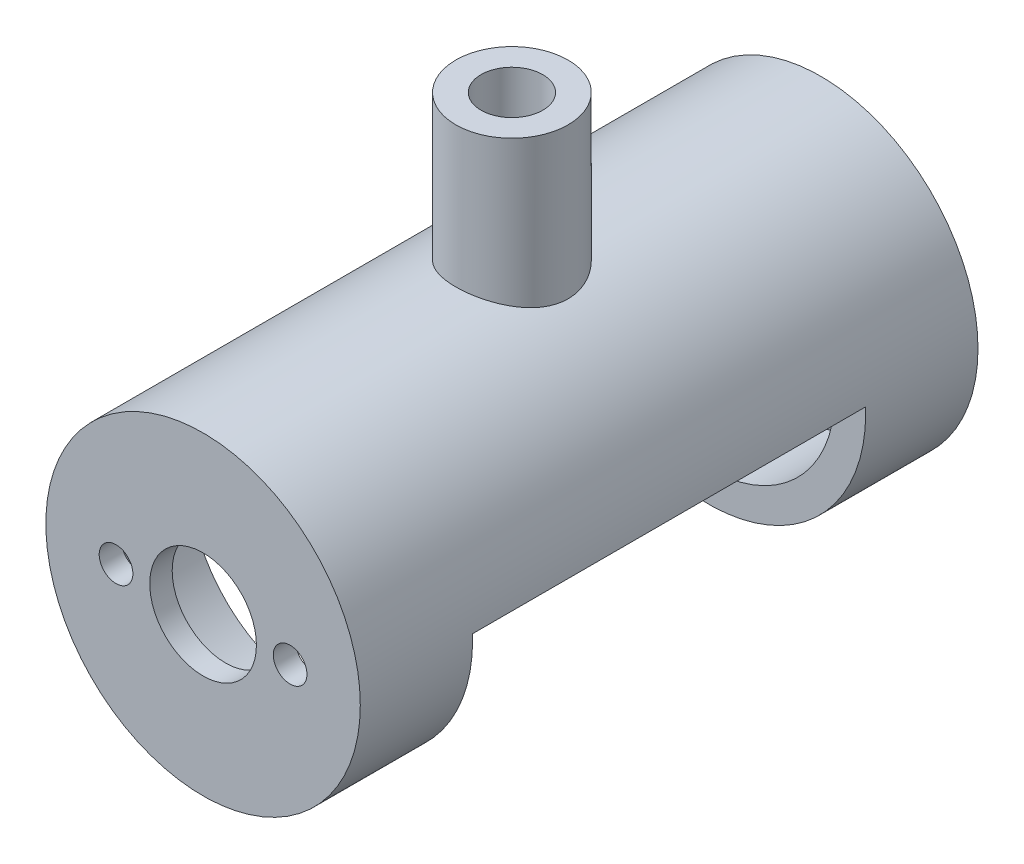
ISO-10303-21;
HEADER;
FILE_DESCRIPTION(('STEP AP214'),'2;1');
FILE_NAME('part.step','',(''),(''),'','','');
FILE_SCHEMA(('AUTOMOTIVE_DESIGN { 1 0 10303 214 1 1 1 1 }'));
ENDSEC;
DATA;
#1=APPLICATION_CONTEXT('core data for automotive mechanical design processes');
#2=APPLICATION_PROTOCOL_DEFINITION('international standard','automotive_design',2000,#1);
#3=PRODUCT_CONTEXT('',#1,'mechanical');
#4=PRODUCT('Part','Part','',(#3));
#5=PRODUCT_RELATED_PRODUCT_CATEGORY('part','',(#4));
#6=PRODUCT_DEFINITION_FORMATION('','',#4);
#7=PRODUCT_DEFINITION_CONTEXT('part definition',#1,'design');
#8=PRODUCT_DEFINITION('design','',#6,#7);
#9=PRODUCT_DEFINITION_SHAPE('','',#8);
#10=(LENGTH_UNIT() NAMED_UNIT(*) SI_UNIT(.MILLI.,.METRE.));
#11=(NAMED_UNIT(*) PLANE_ANGLE_UNIT() SI_UNIT($,.RADIAN.));
#12=(NAMED_UNIT(*) SI_UNIT($,.STERADIAN.) SOLID_ANGLE_UNIT());
#13=UNCERTAINTY_MEASURE_WITH_UNIT(LENGTH_MEASURE(1.E-05),#10,'distance_accuracy_value','');
#14=(GEOMETRIC_REPRESENTATION_CONTEXT(3) GLOBAL_UNCERTAINTY_ASSIGNED_CONTEXT((#13)) GLOBAL_UNIT_ASSIGNED_CONTEXT((#10,
#11,#12)) REPRESENTATION_CONTEXT('',''));
#15=CARTESIAN_POINT('',(0.,0.,0.));
#16=DIRECTION('',(0.,0.,1.));
#17=DIRECTION('',(1.,0.,0.));
#18=AXIS2_PLACEMENT_3D('',#15,#16,#17);
#19=CARTESIAN_POINT('',(0.,-13.5,17.5));
#20=DIRECTION('',(0.,0.,1.));
#21=DIRECTION('',(1.,0.,0.));
#22=AXIS2_PLACEMENT_3D('',#19,#20,#21);
#23=CYLINDRICAL_SURFACE('',#22,14.);
#24=CARTESIAN_POINT('',(0.,-13.5,27.5));
#25=DIRECTION('',(0.,0.,1.));
#26=DIRECTION('',(1.,0.,0.));
#27=AXIS2_PLACEMENT_3D('',#24,#25,#26);
#28=CIRCLE('',#27,14.);
#29=CARTESIAN_POINT('',(14.,-13.5,27.5));
#30=VERTEX_POINT('',#29);
#31=EDGE_CURVE('E95',#30,#30,#28,.T.);
#32=ORIENTED_EDGE('',*,*,#31,.F.);
#33=EDGE_LOOP('',(#32));
#34=FACE_BOUND('',#33,.T.);
#35=CARTESIAN_POINT('',(0.,-13.5,-27.5));
#36=DIRECTION('',(0.,0.,-1.));
#37=DIRECTION('',(-1.,0.,0.));
#38=AXIS2_PLACEMENT_3D('',#35,#36,#37);
#39=CIRCLE('',#38,14.);
#40=CARTESIAN_POINT('',(-14.,-13.5,-27.5));
#41=VERTEX_POINT('',#40);
#42=EDGE_CURVE('E336',#41,#41,#39,.T.);
#43=ORIENTED_EDGE('',*,*,#42,.F.);
#44=EDGE_LOOP('',(#43));
#45=FACE_BOUND('',#44,.T.);
#46=CARTESIAN_POINT('',(0.,0.500000000000002,-5.));
#47=CARTESIAN_POINT('',(-0.135809737919825,0.500000251942587,-5.00000035109385));
#48=CARTESIAN_POINT('',(-0.271614291106981,0.498019447118669,-4.99446237936254));
#49=CARTESIAN_POINT('',(-0.54225702023089,0.490149722900442,-4.9723632682536));
#50=CARTESIAN_POINT('',(-0.677094853246566,0.484259479944528,-4.95579839565292));
#51=CARTESIAN_POINT('',(-0.944706220002117,0.468732511716306,-4.91181333578734));
#52=CARTESIAN_POINT('',(-1.07748062003744,0.459097405411395,-4.88439783933596));
#53=CARTESIAN_POINT('',(-1.34013264362942,0.436334946742313,-4.81895962664486));
#54=CARTESIAN_POINT('',(-1.47000912344286,0.423206241063059,-4.78093279961728));
#55=CARTESIAN_POINT('',(-1.72565362119309,0.393834215093142,-4.69470647940391));
#56=CARTESIAN_POINT('',(-1.85143019462852,0.377597941204405,-4.64652997614828));
#57=CARTESIAN_POINT('',(-2.09839082390053,0.342411329146884,-4.54035817719618));
#58=CARTESIAN_POINT('',(-2.21957315806502,0.323459985985932,-4.48235924423965));
#59=CARTESIAN_POINT('',(-2.5750514260562,0.26323615584615,-4.29427960203682));
#60=CARTESIAN_POINT('',(-2.80148404260274,0.218569115647151,-4.15004629674891));
#61=CARTESIAN_POINT('',(-3.23521018737559,0.122944996946077,-3.82230730123168));
#62=CARTESIAN_POINT('',(-3.44154890844616,0.0718218038497477,-3.63759747563023));
#63=CARTESIAN_POINT('',(-3.82117539449033,-0.0301348056194891,-3.23647232549485));
#64=CARTESIAN_POINT('',(-3.99445436166886,-0.0809681413744132,-3.02004858833491));
#65=CARTESIAN_POINT('',(-4.22869107129882,-0.153645194820497,-2.67183755280845));
#66=CARTESIAN_POINT('',(-4.30350471308028,-0.177642572916036,-2.54959495053473));
#67=CARTESIAN_POINT('',(-4.44251308945513,-0.223350441766006,-2.29882464995287));
#68=CARTESIAN_POINT('',(-4.50671205240721,-0.245061841882197,-2.17029948086912));
#69=CARTESIAN_POINT('',(-4.62396036382352,-0.285506329317238,-1.90779090944507));
#70=CARTESIAN_POINT('',(-4.67700810768227,-0.304238987915534,-1.7738067248863));
#71=CARTESIAN_POINT('',(-4.77143074296404,-0.338086545457018,-1.50140369514912));
#72=CARTESIAN_POINT('',(-4.81281112444964,-0.353203145422675,-1.36298696995622));
#73=CARTESIAN_POINT('',(-4.88217802905966,-0.378808975326995,-1.08797498593406));
#74=CARTESIAN_POINT('',(-4.91060827509873,-0.389450353189266,-0.951505775033819));
#75=CARTESIAN_POINT('',(-4.95598710062016,-0.406536677500179,-0.676467104740633));
#76=CARTESIAN_POINT('',(-4.97294059537927,-0.412983420386088,-0.537898570478235));
#77=CARTESIAN_POINT('',(-4.99519971662274,-0.421463294424703,-0.259709554116053));
#78=CARTESIAN_POINT('',(-5.00050665418348,-0.423496922370344,-0.120089192198412));
#79=CARTESIAN_POINT('',(-4.999417266875,-0.423080326941804,0.159096539436708));
#80=CARTESIAN_POINT('',(-4.99302133885951,-0.42063025561352,0.298661910858433));
#81=CARTESIAN_POINT('',(-4.96925582787826,-0.41158354442139,0.569145442822823));
#82=CARTESIAN_POINT('',(-4.95249439155337,-0.40521679841965,0.700125268075855));
#83=CARTESIAN_POINT('',(-4.90871467197179,-0.388742756508352,0.960162601185794));
#84=CARTESIAN_POINT('',(-4.88169296148016,-0.37863421075543,1.08921945172624));
#85=CARTESIAN_POINT('',(-4.81764465994201,-0.354983287916082,1.34447110183311));
#86=CARTESIAN_POINT('',(-4.78062076223466,-0.341441835286116,1.47066666197233));
#87=CARTESIAN_POINT('',(-4.69688836619738,-0.311322622511204,1.71944630486636));
#88=CARTESIAN_POINT('',(-4.65017616340986,-0.294743701231724,1.84202898565018));
#89=CARTESIAN_POINT('',(-4.49423824121893,-0.240507841022739,2.20740062064977));
#90=CARTESIAN_POINT('',(-4.37029651313278,-0.19877406549533,2.44349976838012));
#91=CARTESIAN_POINT('',(-4.08729285529162,-0.109107584103893,2.89215222293252));
#92=CARTESIAN_POINT('',(-3.92821963194589,-0.061172886910109,3.10469792504487));
#93=CARTESIAN_POINT('',(-3.56806665841638,0.0390490871924341,3.51390766730794));
#94=CARTESIAN_POINT('',(-3.36502761599936,0.0914242329657868,3.70883263121443));
#95=CARTESIAN_POINT('',(-2.92852270488315,0.192109708661412,4.06234645334349));
#96=CARTESIAN_POINT('',(-2.6950529952813,0.240419524196391,4.22093071772918));
#97=CARTESIAN_POINT('',(-2.20020095435867,0.328339909702287,4.4989603760333));
#98=CARTESIAN_POINT('',(-1.93849829448506,0.3678306254663,4.6178762502915));
#99=CARTESIAN_POINT('',(-1.39704686664782,0.432783371681879,4.80943187771662));
#100=CARTESIAN_POINT('',(-1.11730538803626,0.458251029551668,4.8820901957571));
#101=CARTESIAN_POINT('',(-0.562410193206385,0.491324045947987,4.97583823071772));
#102=CARTESIAN_POINT('',(-0.287701200751391,0.499742070081218,4.99927619349799));
#103=CARTESIAN_POINT('',(0.261818717565054,0.500245967713009,5.00069031196031));
#104=CARTESIAN_POINT('',(0.536629612533589,0.492335070027901,4.97867545530265));
#105=CARTESIAN_POINT('',(1.06873750606474,0.461606968129953,4.89162753091541));
#106=CARTESIAN_POINT('',(1.32631209719196,0.439308240693985,4.82808978733781));
#107=CARTESIAN_POINT('',(1.82699848697875,0.382565031642997,4.66172751168481));
#108=CARTESIAN_POINT('',(2.07010840306846,0.348118973082872,4.55889787866075));
#109=CARTESIAN_POINT('',(2.54263735557131,0.269314348221594,4.31367960924547));
#110=CARTESIAN_POINT('',(2.77147674291151,0.224703573589509,4.17025689304724));
#111=CARTESIAN_POINT('',(3.20255291901186,0.130569586508632,3.84915515922489));
#112=CARTESIAN_POINT('',(3.40478054113731,0.0810446916018416,3.67146438938956));
#113=CARTESIAN_POINT('',(3.78806872243883,-0.0206857720331122,3.27570082530642));
#114=CARTESIAN_POINT('',(3.96746111928894,-0.0728956027525246,3.05599799034036));
#115=CARTESIAN_POINT('',(4.20707029265235,-0.146813927178992,2.7056737540284));
#116=CARTESIAN_POINT('',(4.282062011313,-0.17073333704006,2.58536086339757));
#117=CARTESIAN_POINT('',(4.4217048104309,-0.216404300549642,2.33850379149571));
#118=CARTESIAN_POINT('',(4.48636023864871,-0.238156764223399,2.21196225963213));
#119=CARTESIAN_POINT('',(4.60489690992007,-0.27884787105452,1.95325604595851));
#120=CARTESIAN_POINT('',(4.65876125884398,-0.297782090341165,1.82108293378687));
#121=CARTESIAN_POINT('',(4.75508788562331,-0.332169667607298,1.55226025849351));
#122=CARTESIAN_POINT('',(4.79755494120745,-0.347624483708338,1.41561259813427));
#123=CARTESIAN_POINT('',(4.87068051581479,-0.374528893209975,1.13883903551526));
#124=CARTESIAN_POINT('',(4.90134187889161,-0.385979451196398,0.998713979647693));
#125=CARTESIAN_POINT('',(4.95053767017168,-0.404471347160347,0.71606570042772));
#126=CARTESIAN_POINT('',(4.96907283654583,-0.411512953527561,0.57354262359446));
#127=CARTESIAN_POINT('',(4.99307885469791,-0.420653077461596,0.295712751686103));
#128=CARTESIAN_POINT('',(4.99925470157819,-0.423018242073709,0.160475192420979));
#129=CARTESIAN_POINT('',(5.00061847355673,-0.423539604222904,-0.110111689243233));
#130=CARTESIAN_POINT('',(4.99580268043916,-0.421694377482711,-0.245461033974815));
#131=CARTESIAN_POINT('',(4.97522963503319,-0.413854270255558,-0.515140417040736));
#132=CARTESIAN_POINT('',(4.95947735683807,-0.407861276245259,-0.649470890707495));
#133=CARTESIAN_POINT('',(4.91719059273383,-0.391920590724278,-0.916233493426119));
#134=CARTESIAN_POINT('',(4.89065205071167,-0.381971411543208,-1.04866488892405));
#135=CARTESIAN_POINT('',(4.82785805334529,-0.358733811406379,-1.30730062287596));
#136=CARTESIAN_POINT('',(4.79186791799649,-0.34553710856381,-1.43357762426057));
#137=CARTESIAN_POINT('',(4.71020497541157,-0.316076252818109,-1.68260766326246));
#138=CARTESIAN_POINT('',(4.6645287561192,-0.299811019206244,-1.80535944172487));
#139=CARTESIAN_POINT('',(4.51349426075883,-0.247083516273177,-2.16714929686773));
#140=CARTESIAN_POINT('',(4.3940816819264,-0.206670567385657,-2.39991978449126));
#141=CARTESIAN_POINT('',(4.11460292355305,-0.117454010170086,-2.85388461606071));
#142=CARTESIAN_POINT('',(3.95283925958625,-0.0683374911738899,-3.07396212285424));
#143=CARTESIAN_POINT('',(3.59578542291728,0.0316137261424333,-3.48486897241979));
#144=CARTESIAN_POINT('',(3.40048511219728,0.0824489402755297,-3.67568943777039));
#145=CARTESIAN_POINT('',(3.08107053558581,0.157224763249097,-3.94048482740879));
#146=CARTESIAN_POINT('',(2.96730195298126,0.182452934960739,-4.02685425607597));
#147=CARTESIAN_POINT('',(2.73256556739149,0.231257325964937,-4.18968456945351));
#148=CARTESIAN_POINT('',(2.6116004534161,0.254834155206497,-4.26614912164333));
#149=CARTESIAN_POINT('',(2.36319109186864,0.299683606684584,-4.40861018859545));
#150=CARTESIAN_POINT('',(2.23574439432751,0.320955347967177,-4.47460270561924));
#151=CARTESIAN_POINT('',(1.97532322487609,0.360571154642429,-4.59550807176292));
#152=CARTESIAN_POINT('',(1.84235119141244,0.378916494578376,-4.65042574710643));
#153=CARTESIAN_POINT('',(1.57114424812455,0.412234062215863,-4.74893855782964));
#154=CARTESIAN_POINT('',(1.43288754312077,0.427190033680499,-4.79247927295233));
#155=CARTESIAN_POINT('',(1.15282395672585,0.453163193027015,-4.86744288225745));
#156=CARTESIAN_POINT('',(1.01101860846044,0.464182051471321,-4.89887091643628));
#157=CARTESIAN_POINT('',(0.724964125001943,0.481951204677134,-4.94929459553933));
#158=CARTESIAN_POINT('',(0.580715257110368,0.488701963277795,-4.9682915914244));
#159=CARTESIAN_POINT('',(0.290975558507285,0.497726088950336,-4.99364371866119));
#160=CARTESIAN_POINT('',(0.145484804371126,0.499999730109064,-4.99999962389428));
#161=CARTESIAN_POINT('',(0.,0.500000000000002,-5.));
#162=B_SPLINE_CURVE_WITH_KNOTS('',3,(#46,#47,#48,#49,#50,#51,#52,#53,#54,#55,#56,#57,#58,#59,
#60,#61,#62,#63,#64,#65,#66,#67,#68,#69,#70,#71,#72,#73,#74,#75,#76,#77,#78,#79,#80,#81,#82,#83,
#84,#85,#86,#87,#88,#89,#90,#91,#92,#93,#94,#95,#96,#97,#98,#99,#100,#101,#102,#103,#104,#105,
#106,#107,#108,#109,#110,#111,#112,#113,#114,#115,#116,#117,#118,#119,#120,#121,#122,#123,#124,
#125,#126,#127,#128,#129,#130,#131,#132,#133,#134,#135,#136,#137,#138,#139,#140,#141,#142,#143,
#144,#145,#146,#147,#148,#149,#150,#151,#152,#153,#154,#155,#156,#157,#158,#159,#160,#161),
.UNSPECIFIED.,.T.,.F.,(4,2,2,2,2,2,2,2,2,2,2,2,2,2,2,2,2,2,2,2,2,2,2,2,2,2,2,2,2,2,2,2,2,2,2,2,
2,2,2,2,2,2,2,2,2,2,2,2,2,2,2,2,2,2,2,2,2,4),(0.,0.407293549367725,0.814725060573495,
1.22198062785582,1.62939418390025,2.03589464693377,2.44254596814073,3.25520135843811,
4.09647500881857,4.93797222592689,5.37346750186924,5.80878887805697,6.24417285203164,
6.6793516134172,7.098226208036,7.51692129285397,7.93556924190607,8.35420299452808,
8.75034112612816,9.14661169614764,9.54277566657626,9.93909139597209,10.7449687808383,
11.5511056061663,12.4060188501517,13.2610401043917,14.1270562827215,14.9927246771604,
15.8160563856906,16.6392253074655,17.4342723235055,18.2294225891648,19.0470029265114,
19.8648641528352,20.7256534802194,21.1565526491281,21.5872700890203,22.0186566639974,
22.449862118888,22.8809636290182,23.3120388938047,23.7177313781028,24.1235611190587,
24.5292064027856,24.935004368452,25.330444148891,25.7260234605165,26.5165753855614,
27.3456507182853,28.1749771203856,28.6096896421885,29.0442407400284,29.4789573323412,
29.9134840713814,30.3500527626513,30.7864359921976,31.2227717892929,31.6590808733026),.UNSPECIFIED.);
#163=CARTESIAN_POINT('',(0.,0.500000000000002,-5.));
#164=VERTEX_POINT('',#163);
#165=EDGE_CURVE('E164',#164,#164,#162,.T.);
#166=ORIENTED_EDGE('',*,*,#165,.F.);
#167=EDGE_LOOP('',(#166));
#168=FACE_BOUND('',#167,.T.);
#169=DIRECTION('',(0.,0.,1.));
#170=VECTOR('',#169,1.);
#171=CARTESIAN_POINT('',(-13.9910685796332,-13.,17.5));
#172=LINE('',#171,#170);
#173=CARTESIAN_POINT('',(-13.9910685796332,-13.,17.5));
#174=VERTEX_POINT('',#173);
#175=CARTESIAN_POINT('',(-13.9910685796332,-13.,-17.5));
#176=VERTEX_POINT('',#175);
#177=EDGE_CURVE('E92',#174,#176,#172,.F.);
#178=ORIENTED_EDGE('',*,*,#177,.F.);
#179=CARTESIAN_POINT('',(0.,-13.5,17.5));
#180=DIRECTION('',(0.,0.,1.));
#181=DIRECTION('',(1.,0.,0.));
#182=AXIS2_PLACEMENT_3D('',#179,#180,#181);
#183=CIRCLE('',#182,14.);
#184=CARTESIAN_POINT('',(13.9910685796332,-13.,17.5));
#185=VERTEX_POINT('',#184);
#186=EDGE_CURVE('E88',#174,#185,#183,.T.);
#187=ORIENTED_EDGE('',*,*,#186,.T.);
#188=DIRECTION('',(0.,0.,1.));
#189=VECTOR('',#188,1.);
#190=CARTESIAN_POINT('',(13.9910685796332,-13.,17.5));
#191=LINE('',#190,#189);
#192=CARTESIAN_POINT('',(13.9910685796332,-13.,-17.5));
#193=VERTEX_POINT('',#192);
#194=EDGE_CURVE('E90',#193,#185,#191,.T.);
#195=ORIENTED_EDGE('',*,*,#194,.F.);
#196=CARTESIAN_POINT('',(0.,-13.5,-17.5));
#197=DIRECTION('',(0.,0.,-1.));
#198=DIRECTION('',(-1.,0.,0.));
#199=AXIS2_PLACEMENT_3D('',#196,#197,#198);
#200=CIRCLE('',#199,14.);
#201=EDGE_CURVE('E270',#193,#176,#200,.T.);
#202=ORIENTED_EDGE('',*,*,#201,.T.);
#203=EDGE_LOOP('',(#178,#187,#195,#202));
#204=FACE_BOUND('',#203,.T.);
#205=ADVANCED_FACE('F40',(#34,#45,#168,#204),#23,.T.);
#206=CARTESIAN_POINT('',(0.,-13.5,-25.5));
#207=DIRECTION('',(0.,0.,-1.));
#208=DIRECTION('',(-1.,0.,0.));
#209=AXIS2_PLACEMENT_3D('',#206,#207,#208);
#210=PLANE('',#209);
#211=CARTESIAN_POINT('',(0.,-13.5,-25.5));
#212=DIRECTION('',(0.,0.,-1.));
#213=DIRECTION('',(-1.,0.,0.));
#214=AXIS2_PLACEMENT_3D('',#211,#212,#213);
#215=CIRCLE('',#214,4.75);
#216=CARTESIAN_POINT('',(-4.75,-13.5,-25.5));
#217=VERTEX_POINT('',#216);
#218=EDGE_CURVE('E45',#217,#217,#215,.T.);
#219=ORIENTED_EDGE('',*,*,#218,.T.);
#220=EDGE_LOOP('',(#219));
#221=FACE_BOUND('',#220,.T.);
#222=CARTESIAN_POINT('',(-7.75,-13.5,-25.5));
#223=DIRECTION('',(0.,0.,-1.));
#224=DIRECTION('',(-1.,0.,0.));
#225=AXIS2_PLACEMENT_3D('',#222,#223,#224);
#226=CIRCLE('',#225,1.5);
#227=CARTESIAN_POINT('',(-9.25,-13.5,-25.5));
#228=VERTEX_POINT('',#227);
#229=EDGE_CURVE('E147',#228,#228,#226,.F.);
#230=ORIENTED_EDGE('',*,*,#229,.F.);
#231=EDGE_LOOP('',(#230));
#232=FACE_BOUND('',#231,.T.);
#233=CARTESIAN_POINT('',(7.75,-13.5,-25.5));
#234=DIRECTION('',(0.,0.,-1.));
#235=DIRECTION('',(-1.,0.,0.));
#236=AXIS2_PLACEMENT_3D('',#233,#234,#235);
#237=CIRCLE('',#236,1.5);
#238=CARTESIAN_POINT('',(6.25,-13.5,-25.5));
#239=VERTEX_POINT('',#238);
#240=EDGE_CURVE('E143',#239,#239,#237,.F.);
#241=ORIENTED_EDGE('',*,*,#240,.F.);
#242=EDGE_LOOP('',(#241));
#243=FACE_BOUND('',#242,.T.);
#244=CARTESIAN_POINT('',(0.,-13.5,-25.5));
#245=DIRECTION('',(0.,0.,-1.));
#246=DIRECTION('',(-1.,0.,0.));
#247=AXIS2_PLACEMENT_3D('',#244,#245,#246);
#248=CIRCLE('',#247,11.25);
#249=CARTESIAN_POINT('',(-11.25,-13.5,-25.5));
#250=VERTEX_POINT('',#249);
#251=EDGE_CURVE('E257',#250,#250,#248,.F.);
#252=ORIENTED_EDGE('',*,*,#251,.T.);
#253=EDGE_LOOP('',(#252));
#254=FACE_BOUND('',#253,.T.);
#255=ADVANCED_FACE('F190',(#221,#232,#243,#254),#210,.F.);
#256=CARTESIAN_POINT('',(0.,-13.5,25.5));
#257=DIRECTION('',(0.,0.,-1.));
#258=DIRECTION('',(-1.,0.,0.));
#259=AXIS2_PLACEMENT_3D('',#256,#257,#258);
#260=PLANE('',#259);
#261=CARTESIAN_POINT('',(0.,-13.5,25.5));
#262=DIRECTION('',(0.,0.,-1.));
#263=DIRECTION('',(-1.,0.,0.));
#264=AXIS2_PLACEMENT_3D('',#261,#262,#263);
#265=CIRCLE('',#264,4.75);
#266=CARTESIAN_POINT('',(-4.75,-13.5,25.5));
#267=VERTEX_POINT('',#266);
#268=EDGE_CURVE('E126',#267,#267,#265,.T.);
#269=ORIENTED_EDGE('',*,*,#268,.F.);
#270=EDGE_LOOP('',(#269));
#271=FACE_BOUND('',#270,.T.);
#272=CARTESIAN_POINT('',(7.75,-13.5,25.5));
#273=DIRECTION('',(0.,0.,-1.));
#274=DIRECTION('',(-1.,0.,0.));
#275=AXIS2_PLACEMENT_3D('',#272,#273,#274);
#276=CIRCLE('',#275,1.5);
#277=CARTESIAN_POINT('',(6.25,-13.5,25.5));
#278=VERTEX_POINT('',#277);
#279=EDGE_CURVE('E157',#278,#278,#276,.F.);
#280=ORIENTED_EDGE('',*,*,#279,.T.);
#281=EDGE_LOOP('',(#280));
#282=FACE_BOUND('',#281,.T.);
#283=CARTESIAN_POINT('',(-7.75,-13.5,25.5));
#284=DIRECTION('',(0.,0.,-1.));
#285=DIRECTION('',(-1.,0.,0.));
#286=AXIS2_PLACEMENT_3D('',#283,#284,#285);
#287=CIRCLE('',#286,1.5);
#288=CARTESIAN_POINT('',(-9.25,-13.5,25.5));
#289=VERTEX_POINT('',#288);
#290=EDGE_CURVE('E161',#289,#289,#287,.F.);
#291=ORIENTED_EDGE('',*,*,#290,.T.);
#292=EDGE_LOOP('',(#291));
#293=FACE_BOUND('',#292,.T.);
#294=CARTESIAN_POINT('',(0.,-13.5,25.5));
#295=DIRECTION('',(0.,0.,-1.));
#296=DIRECTION('',(-1.,0.,0.));
#297=AXIS2_PLACEMENT_3D('',#294,#295,#296);
#298=CIRCLE('',#297,11.25);
#299=CARTESIAN_POINT('',(-11.25,-13.5,25.5));
#300=VERTEX_POINT('',#299);
#301=EDGE_CURVE('E108',#300,#300,#298,.F.);
#302=ORIENTED_EDGE('',*,*,#301,.F.);
#303=EDGE_LOOP('',(#302));
#304=FACE_BOUND('',#303,.T.);
#305=ADVANCED_FACE('F216',(#271,#282,#293,#304),#260,.T.);
#306=CARTESIAN_POINT('',(-7.75,-13.5,24.5));
#307=DIRECTION('',(0.,0.,1.));
#308=DIRECTION('',(1.,0.,0.));
#309=AXIS2_PLACEMENT_3D('',#306,#307,#308);
#310=CYLINDRICAL_SURFACE('',#309,1.5);
#311=CARTESIAN_POINT('',(-7.75,-13.5,27.5));
#312=DIRECTION('',(0.,0.,1.));
#313=DIRECTION('',(1.,0.,0.));
#314=AXIS2_PLACEMENT_3D('',#311,#312,#313);
#315=CIRCLE('',#314,1.5);
#316=CARTESIAN_POINT('',(-6.25,-13.5,27.5));
#317=VERTEX_POINT('',#316);
#318=EDGE_CURVE('E236',#317,#317,#315,.T.);
#319=ORIENTED_EDGE('',*,*,#318,.T.);
#320=EDGE_LOOP('',(#319));
#321=FACE_BOUND('',#320,.T.);
#322=ORIENTED_EDGE('',*,*,#290,.F.);
#323=EDGE_LOOP('',(#322));
#324=FACE_BOUND('',#323,.T.);
#325=ADVANCED_FACE('F212',(#321,#324),#310,.F.);
#326=CARTESIAN_POINT('',(7.75,-13.5,24.5));
#327=DIRECTION('',(0.,0.,1.));
#328=DIRECTION('',(1.,0.,0.));
#329=AXIS2_PLACEMENT_3D('',#326,#327,#328);
#330=CYLINDRICAL_SURFACE('',#329,1.5);
#331=CARTESIAN_POINT('',(7.75,-13.5,27.5));
#332=DIRECTION('',(0.,0.,1.));
#333=DIRECTION('',(1.,0.,0.));
#334=AXIS2_PLACEMENT_3D('',#331,#332,#333);
#335=CIRCLE('',#334,1.5);
#336=CARTESIAN_POINT('',(9.25,-13.5,27.5));
#337=VERTEX_POINT('',#336);
#338=EDGE_CURVE('E243',#337,#337,#335,.T.);
#339=ORIENTED_EDGE('',*,*,#338,.T.);
#340=EDGE_LOOP('',(#339));
#341=FACE_BOUND('',#340,.T.);
#342=ORIENTED_EDGE('',*,*,#279,.F.);
#343=EDGE_LOOP('',(#342));
#344=FACE_BOUND('',#343,.T.);
#345=ADVANCED_FACE('F208',(#341,#344),#330,.F.);
#346=CARTESIAN_POINT('',(31.,-13.,45.));
#347=DIRECTION('',(0.,-1.,0.));
#348=DIRECTION('',(0.,0.,-1.));
#349=AXIS2_PLACEMENT_3D('',#346,#347,#348);
#350=PLANE('',#349);
#351=DIRECTION('',(0.,0.,-1.));
#352=VECTOR('',#351,1.);
#353=CARTESIAN_POINT('',(-11.7393568818739,-13.,25.5));
#354=LINE('',#353,#352);
#355=CARTESIAN_POINT('',(-11.7393568818739,-13.,17.5));
#356=VERTEX_POINT('',#355);
#357=CARTESIAN_POINT('',(-11.7393568818739,-13.,-17.5));
#358=VERTEX_POINT('',#357);
#359=EDGE_CURVE('E154',#356,#358,#354,.T.);
#360=ORIENTED_EDGE('',*,*,#359,.F.);
#361=DIRECTION('',(-1.,0.,0.));
#362=VECTOR('',#361,1.);
#363=CARTESIAN_POINT('',(31.,-13.,17.5));
#364=LINE('',#363,#362);
#365=EDGE_CURVE('E232',#356,#174,#364,.T.);
#366=ORIENTED_EDGE('',*,*,#365,.T.);
#367=ORIENTED_EDGE('',*,*,#177,.T.);
#368=DIRECTION('',(1.,0.,0.));
#369=VECTOR('',#368,1.);
#370=CARTESIAN_POINT('',(31.,-13.,-17.5));
#371=LINE('',#370,#369);
#372=EDGE_CURVE('E233',#176,#358,#371,.T.);
#373=ORIENTED_EDGE('',*,*,#372,.T.);
#374=EDGE_LOOP('',(#360,#366,#367,#373));
#375=FACE_BOUND('',#374,.T.);
#376=ADVANCED_FACE('F211',(#375),#350,.T.);
#377=DIRECTION('',(0.,0.,-1.));
#378=VECTOR('',#377,1.);
#379=CARTESIAN_POINT('',(11.7393568818739,-13.,25.5));
#380=LINE('',#379,#378);
#381=CARTESIAN_POINT('',(11.7393568818739,-13.,-17.5));
#382=VERTEX_POINT('',#381);
#383=CARTESIAN_POINT('',(11.7393568818739,-13.,17.5));
#384=VERTEX_POINT('',#383);
#385=EDGE_CURVE('E151',#382,#384,#380,.F.);
#386=ORIENTED_EDGE('',*,*,#385,.F.);
#387=DIRECTION('',(1.,0.,0.));
#388=VECTOR('',#387,1.);
#389=CARTESIAN_POINT('',(31.,-13.,-17.5));
#390=LINE('',#389,#388);
#391=EDGE_CURVE('E106',#382,#193,#390,.T.);
#392=ORIENTED_EDGE('',*,*,#391,.T.);
#393=ORIENTED_EDGE('',*,*,#194,.T.);
#394=DIRECTION('',(-1.,0.,0.));
#395=VECTOR('',#394,1.);
#396=CARTESIAN_POINT('',(31.,-13.,17.5));
#397=LINE('',#396,#395);
#398=EDGE_CURVE('E51',#185,#384,#397,.T.);
#399=ORIENTED_EDGE('',*,*,#398,.T.);
#400=EDGE_LOOP('',(#386,#392,#393,#399));
#401=FACE_BOUND('',#400,.T.);
#402=ADVANCED_FACE('F105',(#401),#350,.T.);
#403=CARTESIAN_POINT('',(0.,-13.5,27.5));
#404=DIRECTION('',(0.,0.,1.));
#405=DIRECTION('',(1.,0.,0.));
#406=AXIS2_PLACEMENT_3D('',#403,#404,#405);
#407=PLANE('',#406);
#408=ORIENTED_EDGE('',*,*,#31,.T.);
#409=EDGE_LOOP('',(#408));
#410=FACE_BOUND('',#409,.T.);
#411=CARTESIAN_POINT('',(0.,-13.5,27.5));
#412=DIRECTION('',(0.,0.,1.));
#413=DIRECTION('',(1.,0.,0.));
#414=AXIS2_PLACEMENT_3D('',#411,#412,#413);
#415=CIRCLE('',#414,4.75);
#416=CARTESIAN_POINT('',(4.75,-13.5,27.5));
#417=VERTEX_POINT('',#416);
#418=EDGE_CURVE('E122',#417,#417,#415,.T.);
#419=ORIENTED_EDGE('',*,*,#418,.F.);
#420=EDGE_LOOP('',(#419));
#421=FACE_BOUND('',#420,.T.);
#422=ORIENTED_EDGE('',*,*,#338,.F.);
#423=EDGE_LOOP('',(#422));
#424=FACE_BOUND('',#423,.T.);
#425=ORIENTED_EDGE('',*,*,#318,.F.);
#426=EDGE_LOOP('',(#425));
#427=FACE_BOUND('',#426,.T.);
#428=ADVANCED_FACE('F220',(#410,#421,#424,#427),#407,.T.);
#429=CARTESIAN_POINT('',(0.,-13.5,17.5));
#430=DIRECTION('',(0.,0.,1.));
#431=DIRECTION('',(1.,0.,0.));
#432=AXIS2_PLACEMENT_3D('',#429,#430,#431);
#433=PLANE('',#432);
#434=CARTESIAN_POINT('',(0.,-13.5,17.5));
#435=DIRECTION('',(0.,0.,-1.));
#436=DIRECTION('',(-1.,0.,0.));
#437=AXIS2_PLACEMENT_3D('',#434,#435,#436);
#438=CIRCLE('',#437,11.25);
#439=CARTESIAN_POINT('',(-11.25,-13.5,17.5));
#440=VERTEX_POINT('',#439);
#441=EDGE_CURVE('E114',#440,#440,#438,.T.);
#442=ORIENTED_EDGE('',*,*,#441,.F.);
#443=EDGE_LOOP('',(#442));
#444=FACE_BOUND('',#443,.T.);
#445=ORIENTED_EDGE('',*,*,#398,.F.);
#446=ORIENTED_EDGE('',*,*,#186,.F.);
#447=ORIENTED_EDGE('',*,*,#365,.F.);
#448=CARTESIAN_POINT('',(0.,-13.5,17.5));
#449=DIRECTION('',(0.,0.,-1.));
#450=DIRECTION('',(-1.,0.,0.));
#451=AXIS2_PLACEMENT_3D('',#448,#449,#450);
#452=CIRCLE('',#451,11.75);
#453=EDGE_CURVE('E67',#356,#384,#452,.T.);
#454=ORIENTED_EDGE('',*,*,#453,.T.);
#455=EDGE_LOOP('',(#445,#446,#447,#454));
#456=FACE_BOUND('',#455,.T.);
#457=ADVANCED_FACE('F98',(#444,#456),#433,.F.);
#458=CARTESIAN_POINT('',(0.,-13.5,-27.5));
#459=DIRECTION('',(0.,0.,-1.));
#460=DIRECTION('',(-1.,0.,0.));
#461=AXIS2_PLACEMENT_3D('',#458,#459,#460);
#462=PLANE('',#461);
#463=ORIENTED_EDGE('',*,*,#42,.T.);
#464=EDGE_LOOP('',(#463));
#465=FACE_BOUND('',#464,.T.);
#466=CARTESIAN_POINT('',(0.,-13.5,-27.5));
#467=DIRECTION('',(0.,0.,-1.));
#468=DIRECTION('',(-1.,0.,0.));
#469=AXIS2_PLACEMENT_3D('',#466,#467,#468);
#470=CIRCLE('',#469,4.75);
#471=CARTESIAN_POINT('',(-4.75,-13.5,-27.5));
#472=VERTEX_POINT('',#471);
#473=EDGE_CURVE('E130',#472,#472,#470,.T.);
#474=ORIENTED_EDGE('',*,*,#473,.F.);
#475=EDGE_LOOP('',(#474));
#476=FACE_BOUND('',#475,.T.);
#477=CARTESIAN_POINT('',(7.75,-13.5,-27.5));
#478=DIRECTION('',(0.,0.,-1.));
#479=DIRECTION('',(-1.,0.,0.));
#480=AXIS2_PLACEMENT_3D('',#477,#478,#479);
#481=CIRCLE('',#480,1.5);
#482=CARTESIAN_POINT('',(6.25,-13.5,-27.5));
#483=VERTEX_POINT('',#482);
#484=EDGE_CURVE('E94',#483,#483,#481,.T.);
#485=ORIENTED_EDGE('',*,*,#484,.F.);
#486=EDGE_LOOP('',(#485));
#487=FACE_BOUND('',#486,.T.);
#488=CARTESIAN_POINT('',(-7.75,-13.5,-27.5));
#489=DIRECTION('',(0.,0.,-1.));
#490=DIRECTION('',(-1.,0.,0.));
#491=AXIS2_PLACEMENT_3D('',#488,#489,#490);
#492=CIRCLE('',#491,1.5);
#493=CARTESIAN_POINT('',(-9.25,-13.5,-27.5));
#494=VERTEX_POINT('',#493);
#495=EDGE_CURVE('E272',#494,#494,#492,.T.);
#496=ORIENTED_EDGE('',*,*,#495,.F.);
#497=EDGE_LOOP('',(#496));
#498=FACE_BOUND('',#497,.T.);
#499=ADVANCED_FACE('F203',(#465,#476,#487,#498),#462,.T.);
#500=CARTESIAN_POINT('',(0.,-13.5,-17.5));
#501=DIRECTION('',(0.,0.,-1.));
#502=DIRECTION('',(-1.,0.,0.));
#503=AXIS2_PLACEMENT_3D('',#500,#501,#502);
#504=PLANE('',#503);
#505=CARTESIAN_POINT('',(0.,-13.5,-17.5));
#506=DIRECTION('',(0.,0.,1.));
#507=DIRECTION('',(1.,0.,0.));
#508=AXIS2_PLACEMENT_3D('',#505,#506,#507);
#509=CIRCLE('',#508,11.25);
#510=CARTESIAN_POINT('',(11.25,-13.5,-17.5));
#511=VERTEX_POINT('',#510);
#512=EDGE_CURVE('E260',#511,#511,#509,.T.);
#513=ORIENTED_EDGE('',*,*,#512,.F.);
#514=EDGE_LOOP('',(#513));
#515=FACE_BOUND('',#514,.T.);
#516=ORIENTED_EDGE('',*,*,#391,.F.);
#517=CARTESIAN_POINT('',(0.,-13.5,-17.5));
#518=DIRECTION('',(0.,0.,1.));
#519=DIRECTION('',(1.,0.,0.));
#520=AXIS2_PLACEMENT_3D('',#517,#518,#519);
#521=CIRCLE('',#520,11.75);
#522=EDGE_CURVE('E59',#382,#358,#521,.T.);
#523=ORIENTED_EDGE('',*,*,#522,.T.);
#524=ORIENTED_EDGE('',*,*,#372,.F.);
#525=ORIENTED_EDGE('',*,*,#201,.F.);
#526=EDGE_LOOP('',(#516,#523,#524,#525));
#527=FACE_BOUND('',#526,.T.);
#528=ADVANCED_FACE('F199',(#515,#527),#504,.F.);
#529=CARTESIAN_POINT('',(-7.75,-13.5,-24.5));
#530=DIRECTION('',(0.,0.,-1.));
#531=DIRECTION('',(-1.,0.,0.));
#532=AXIS2_PLACEMENT_3D('',#529,#530,#531);
#533=CYLINDRICAL_SURFACE('',#532,1.5);
#534=ORIENTED_EDGE('',*,*,#229,.T.);
#535=EDGE_LOOP('',(#534));
#536=FACE_BOUND('',#535,.T.);
#537=ORIENTED_EDGE('',*,*,#495,.T.);
#538=EDGE_LOOP('',(#537));
#539=FACE_BOUND('',#538,.T.);
#540=ADVANCED_FACE('F195',(#536,#539),#533,.F.);
#541=CARTESIAN_POINT('',(7.75,-13.5,-24.5));
#542=DIRECTION('',(0.,0.,-1.));
#543=DIRECTION('',(-1.,0.,0.));
#544=AXIS2_PLACEMENT_3D('',#541,#542,#543);
#545=CYLINDRICAL_SURFACE('',#544,1.5);
#546=ORIENTED_EDGE('',*,*,#240,.T.);
#547=EDGE_LOOP('',(#546));
#548=FACE_BOUND('',#547,.T.);
#549=ORIENTED_EDGE('',*,*,#484,.T.);
#550=EDGE_LOOP('',(#549));
#551=FACE_BOUND('',#550,.T.);
#552=ADVANCED_FACE('F192',(#548,#551),#545,.F.);
#553=CARTESIAN_POINT('',(0.,13.,0.));
#554=DIRECTION('',(0.,-1.,0.));
#555=DIRECTION('',(0.,0.,-1.));
#556=AXIS2_PLACEMENT_3D('',#553,#554,#555);
#557=CYLINDRICAL_SURFACE('',#556,5.);
#558=ORIENTED_EDGE('',*,*,#165,.T.);
#559=EDGE_LOOP('',(#558));
#560=FACE_BOUND('',#559,.T.);
#561=CARTESIAN_POINT('',(0.,13.,0.));
#562=DIRECTION('',(0.,1.,0.));
#563=DIRECTION('',(0.,0.,1.));
#564=AXIS2_PLACEMENT_3D('',#561,#562,#563);
#565=CIRCLE('',#564,5.);
#566=CARTESIAN_POINT('',(0.,13.,5.));
#567=VERTEX_POINT('',#566);
#568=EDGE_CURVE('E102',#567,#567,#565,.T.);
#569=ORIENTED_EDGE('',*,*,#568,.F.);
#570=EDGE_LOOP('',(#569));
#571=FACE_BOUND('',#570,.T.);
#572=ADVANCED_FACE('F42',(#560,#571),#557,.T.);
#573=CARTESIAN_POINT('',(0.,13.,0.));
#574=DIRECTION('',(0.,1.,0.));
#575=DIRECTION('',(0.,0.,1.));
#576=AXIS2_PLACEMENT_3D('',#573,#574,#575);
#577=PLANE('',#576);
#578=CARTESIAN_POINT('',(0.,13.,0.));
#579=DIRECTION('',(0.,1.,0.));
#580=DIRECTION('',(0.,0.,1.));
#581=AXIS2_PLACEMENT_3D('',#578,#579,#580);
#582=CIRCLE('',#581,2.75);
#583=CARTESIAN_POINT('',(0.,13.,2.75));
#584=VERTEX_POINT('',#583);
#585=EDGE_CURVE('E138',#584,#584,#582,.T.);
#586=ORIENTED_EDGE('',*,*,#585,.F.);
#587=EDGE_LOOP('',(#586));
#588=FACE_BOUND('',#587,.T.);
#589=ORIENTED_EDGE('',*,*,#568,.T.);
#590=EDGE_LOOP('',(#589));
#591=FACE_BOUND('',#590,.T.);
#592=ADVANCED_FACE('F319',(#588,#591),#577,.T.);
#593=CARTESIAN_POINT('',(0.,-13.5,25.5));
#594=DIRECTION('',(0.,0.,-1.));
#595=DIRECTION('',(-1.,0.,0.));
#596=AXIS2_PLACEMENT_3D('',#593,#594,#595);
#597=CYLINDRICAL_SURFACE('',#596,11.75);
#598=ORIENTED_EDGE('',*,*,#385,.T.);
#599=ORIENTED_EDGE('',*,*,#453,.F.);
#600=ORIENTED_EDGE('',*,*,#359,.T.);
#601=ORIENTED_EDGE('',*,*,#522,.F.);
#602=EDGE_LOOP('',(#598,#599,#600,#601));
#603=FACE_BOUND('',#602,.T.);
#604=ADVANCED_FACE('F185',(#603),#597,.F.);
#605=CARTESIAN_POINT('',(0.,0.999999999999968,0.));
#606=DIRECTION('',(0.,1.,0.));
#607=DIRECTION('',(0.,0.,1.));
#608=AXIS2_PLACEMENT_3D('',#605,#606,#607);
#609=CYLINDRICAL_SURFACE('',#608,2.75);
#610=CARTESIAN_POINT('',(0.,0.999999999999968,0.));
#611=DIRECTION('',(0.,1.,0.));
#612=DIRECTION('',(0.,0.,1.));
#613=AXIS2_PLACEMENT_3D('',#610,#611,#612);
#614=CIRCLE('',#613,2.75);
#615=CARTESIAN_POINT('',(0.,0.999999999999968,2.75));
#616=VERTEX_POINT('',#615);
#617=EDGE_CURVE('E139',#616,#616,#614,.T.);
#618=ORIENTED_EDGE('',*,*,#617,.F.);
#619=EDGE_LOOP('',(#618));
#620=FACE_BOUND('',#619,.T.);
#621=ORIENTED_EDGE('',*,*,#585,.T.);
#622=EDGE_LOOP('',(#621));
#623=FACE_BOUND('',#622,.T.);
#624=ADVANCED_FACE('F312',(#620,#623),#609,.F.);
#625=CARTESIAN_POINT('',(0.,0.999999999999968,0.));
#626=DIRECTION('',(0.,1.,0.));
#627=DIRECTION('',(0.,0.,1.));
#628=AXIS2_PLACEMENT_3D('',#625,#626,#627);
#629=PLANE('',#628);
#630=CARTESIAN_POINT('',(0.,0.999999999999968,0.));
#631=DIRECTION('',(0.,1.,0.));
#632=DIRECTION('',(0.,0.,1.));
#633=AXIS2_PLACEMENT_3D('',#630,#631,#632);
#634=CIRCLE('',#633,2.5);
#635=CARTESIAN_POINT('',(0.,0.999999999999968,2.5));
#636=VERTEX_POINT('',#635);
#637=EDGE_CURVE('E134',#636,#636,#634,.T.);
#638=ORIENTED_EDGE('',*,*,#637,.F.);
#639=EDGE_LOOP('',(#638));
#640=FACE_BOUND('',#639,.T.);
#641=ORIENTED_EDGE('',*,*,#617,.T.);
#642=EDGE_LOOP('',(#641));
#643=FACE_BOUND('',#642,.T.);
#644=ADVANCED_FACE('F183',(#640,#643),#629,.T.);
#645=CARTESIAN_POINT('',(0.,-13.5,19.5));
#646=DIRECTION('',(0.,0.,-1.));
#647=DIRECTION('',(-1.,0.,0.));
#648=AXIS2_PLACEMENT_3D('',#645,#646,#647);
#649=CYLINDRICAL_SURFACE('',#648,14.);
#650=CARTESIAN_POINT('',(0.,0.500000000000002,-2.5));
#651=CARTESIAN_POINT('',(-0.139239584884692,0.499997527951941,-2.49999455739785));
#652=CARTESIAN_POINT('',(-0.278551398798767,0.497901218571732,-2.48832809754965));
#653=CARTESIAN_POINT('',(-0.55325746155145,0.489740591758373,-2.44199583361771));
#654=CARTESIAN_POINT('',(-0.688648164109867,0.483672792730412,-2.40730984916213));
#655=CARTESIAN_POINT('',(-0.951498716003345,0.468248755067324,-2.31602776676197));
#656=CARTESIAN_POINT('',(-1.07896532023462,0.458895363762736,-2.2594506356316));
#657=CARTESIAN_POINT('',(-1.32258294398845,0.437924632987841,-2.12604431178294));
#658=CARTESIAN_POINT('',(-1.43873504418376,0.426307510050073,-2.04921705580053));
#659=CARTESIAN_POINT('',(-1.65770744324836,0.401952324679481,-1.87660078698247));
#660=CARTESIAN_POINT('',(-1.76038642030698,0.389204420526705,-1.7806338701291));
#661=CARTESIAN_POINT('',(-1.94827611327337,0.364098486117716,-1.57284525046249));
#662=CARTESIAN_POINT('',(-2.03348564380397,0.351740482366032,-1.46102247263114));
#663=CARTESIAN_POINT('',(-2.18459604528548,0.328718102426011,-1.22370988288653));
#664=CARTESIAN_POINT('',(-2.25035491937039,0.318066429528663,-1.09812831307603));
#665=CARTESIAN_POINT('',(-2.35978878168924,0.29980052433598,-0.8374788413355));
#666=CARTESIAN_POINT('',(-2.40346549014524,0.292186055449273,-0.702411679276168));
#667=CARTESIAN_POINT('',(-2.46704527057167,0.280955311151217,-0.428131178585148));
#668=CARTESIAN_POINT('',(-2.48719373563911,0.277297795918937,-0.288976444858396));
#669=CARTESIAN_POINT('',(-2.50390640595674,0.274270570238679,-0.00921707799266542));
#670=CARTESIAN_POINT('',(-2.50047252779549,0.274900511339719,0.131387436392096));
#671=CARTESIAN_POINT('',(-2.47031736473549,0.280339427769972,0.408288897436546));
#672=CARTESIAN_POINT('',(-2.44387361595034,0.285098596002207,0.544617190254226));
#673=CARTESIAN_POINT('',(-2.3688857538611,0.298181616489451,0.810870636498552));
#674=CARTESIAN_POINT('',(-2.3203407810603,0.306505607376459,0.940795540685383));
#675=CARTESIAN_POINT('',(-2.2022526779638,0.325833206234402,1.19137447886924));
#676=CARTESIAN_POINT('',(-2.13259607876041,0.336851230427044,1.31197388160888));
#677=CARTESIAN_POINT('',(-1.97434240206301,0.360315706334092,1.53987750221547));
#678=CARTESIAN_POINT('',(-1.88574357580469,0.372762289885275,1.64718049109919));
#679=CARTESIAN_POINT('',(-1.69061708906587,0.397899310027708,1.84705021778733));
#680=CARTESIAN_POINT('',(-1.58385171151662,0.410590692487733,1.93938491797957));
#681=CARTESIAN_POINT('',(-1.35622200140276,0.434623736005022,2.10486613290801));
#682=CARTESIAN_POINT('',(-1.23535755129116,0.44596538580768,2.17801248765032));
#683=CARTESIAN_POINT('',(-0.98272912541029,0.46604083859032,2.30306902369628));
#684=CARTESIAN_POINT('',(-0.850953766692501,0.474771873100645,2.3549566822979));
#685=CARTESIAN_POINT('',(-0.580367401035939,0.488620619970469,2.43579688219198));
#686=CARTESIAN_POINT('',(-0.441557072364819,0.493738679962664,2.46475163007287));
#687=CARTESIAN_POINT('',(-0.162838985381711,0.499737506352999,2.49858484604504));
#688=CARTESIAN_POINT('',(-0.0229710170574319,0.500674269224887,2.50378150854804));
#689=CARTESIAN_POINT('',(0.255635962261019,0.498359053791927,2.49080226023669));
#690=CARTESIAN_POINT('',(0.39437502309646,0.495107261432681,2.47262738697212));
#691=CARTESIAN_POINT('',(0.665788309880039,0.484815083456159,2.4136856015097));
#692=CARTESIAN_POINT('',(0.798498270193175,0.477801450605069,2.37307816078221));
#693=CARTESIAN_POINT('',(1.0552266666947,0.460768732276985,2.27059536981458));
#694=CARTESIAN_POINT('',(1.17924455600831,0.450749457904539,2.2087186828312));
#695=CARTESIAN_POINT('',(1.4164370995142,0.428677338682749,2.06473877708765));
#696=CARTESIAN_POINT('',(1.52949072853056,0.416605133777143,1.9824392084602));
#697=CARTESIAN_POINT('',(1.74029662989026,0.391819680314161,1.80021734893848));
#698=CARTESIAN_POINT('',(1.8380476135904,0.37910637788871,1.70029357540657));
#699=CARTESIAN_POINT('',(2.01666949257316,0.354287891259912,1.48422503075245));
#700=CARTESIAN_POINT('',(2.09732417121667,0.342191815217934,1.36790029913286));
#701=CARTESIAN_POINT('',(2.23794827077399,0.320154666442719,1.12316631055121));
#702=CARTESIAN_POINT('',(2.29791841370413,0.31021351849386,0.994757475597178));
#703=CARTESIAN_POINT('',(2.39515706197427,0.293681903638452,0.730073825159321));
#704=CARTESIAN_POINT('',(2.43252842924635,0.287076277601653,0.593837789181893));
#705=CARTESIAN_POINT('',(2.48382895891452,0.277927442409159,0.316892704853756));
#706=CARTESIAN_POINT('',(2.49776049425864,0.275383822034762,0.176184110755291));
#707=CARTESIAN_POINT('',(2.50171229780526,0.27466648434155,-0.103549208901465));
#708=CARTESIAN_POINT('',(2.49207328035334,0.276430499277444,-0.24256907714185));
#709=CARTESIAN_POINT('',(2.44989946243099,0.283992310472123,-0.516973818018074));
#710=CARTESIAN_POINT('',(2.41736476961371,0.289790087764564,-0.652358707742105));
#711=CARTESIAN_POINT('',(2.3304611386535,0.304741058804231,-0.91548987603338));
#712=CARTESIAN_POINT('',(2.27612576514715,0.313889092569206,-1.04324755178609));
#713=CARTESIAN_POINT('',(2.14719934056736,0.334514026440372,-1.28788843943675));
#714=CARTESIAN_POINT('',(2.07260704454505,0.34599106967174,-1.4047709823784));
#715=CARTESIAN_POINT('',(1.90408567428783,0.37017597764608,-1.62605704739002));
#716=CARTESIAN_POINT('',(1.80990741155503,0.382898459028049,-1.73026923174324));
#717=CARTESIAN_POINT('',(1.60540999726032,0.40802824353188,-1.92152580596623));
#718=CARTESIAN_POINT('',(1.49508713803928,0.420435473485002,-2.00856624147728));
#719=CARTESIAN_POINT('',(1.26037074660264,0.443653467880598,-2.16365776778883));
#720=CARTESIAN_POINT('',(1.13587103767058,0.454450568428477,-2.23155025939159));
#721=CARTESIAN_POINT('',(0.877084840190479,0.473098711251112,-2.34534920329274));
#722=CARTESIAN_POINT('',(0.742807935956543,0.480952593458126,-2.39127686149759));
#723=CARTESIAN_POINT('',(0.506731755491749,0.491177973574845,-2.45023061339608));
#724=CARTESIAN_POINT('',(0.40633486767167,0.49446799718631,-2.46886313693672));
#725=CARTESIAN_POINT('',(0.203971552038939,0.498879892524316,-2.49374969040371));
#726=CARTESIAN_POINT('',(0.102005158109661,0.500001810991133,-2.50000398718147));
#727=CARTESIAN_POINT('',(0.,0.500000000000002,-2.5));
#728=B_SPLINE_CURVE_WITH_KNOTS('',3,(#650,#651,#652,#653,#654,#655,#656,#657,#658,#659,#660,
#661,#662,#663,#664,#665,#666,#667,#668,#669,#670,#671,#672,#673,#674,#675,#676,#677,#678,#679,
#680,#681,#682,#683,#684,#685,#686,#687,#688,#689,#690,#691,#692,#693,#694,#695,#696,#697,#698,
#699,#700,#701,#702,#703,#704,#705,#706,#707,#708,#709,#710,#711,#712,#713,#714,#715,#716,#717,
#718,#719,#720,#721,#722,#723,#724,#725,#726,#727),.UNSPECIFIED.,.T.,.F.,(4,2,2,2,2,2,2,2,2,2,2,
2,2,2,2,2,2,2,2,2,2,2,2,2,2,2,2,2,2,2,2,2,2,2,2,2,2,2,4),(0.,0.41734579674163,0.835057949374025,
1.25240899749004,1.66972014433903,2.09110796789027,2.5125243749628,2.93694536469338,
3.36133328652202,3.78125426758825,4.20114112116257,4.61603258426601,5.03094018350354,
5.44811857395103,5.86533549534551,6.28850377891475,6.71167559078141,7.13529458336167,
7.55887281066884,7.97676106621614,8.3946307707832,8.80956740145243,9.22453011509511,
9.64364840488131,10.062801969859,10.4869762077788,10.9111356379343,11.3333496148672,
11.7555208460958,12.1716257235315,12.5877286444974,13.0031933708605,13.4186836366131,
13.8398246877353,14.2610626074926,14.6856934454013,15.109913492521,15.4156623340469,
15.7214045841282),.UNSPECIFIED.);
#729=CARTESIAN_POINT('',(0.,0.500000000000002,-2.5));
#730=VERTEX_POINT('',#729);
#731=EDGE_CURVE('E11',#730,#730,#728,.T.);
#732=ORIENTED_EDGE('',*,*,#731,.T.);
#733=EDGE_LOOP('',(#732));
#734=FACE_BOUND('',#733,.T.);
#735=ADVANCED_FACE('F178',(#734),#649,.T.);
#736=CARTESIAN_POINT('',(0.,13.,0.));
#737=DIRECTION('',(0.,-1.,0.));
#738=DIRECTION('',(0.,0.,-1.));
#739=AXIS2_PLACEMENT_3D('',#736,#737,#738);
#740=CYLINDRICAL_SURFACE('',#739,2.5);
#741=ORIENTED_EDGE('',*,*,#731,.F.);
#742=EDGE_LOOP('',(#741));
#743=FACE_BOUND('',#742,.T.);
#744=ORIENTED_EDGE('',*,*,#637,.T.);
#745=EDGE_LOOP('',(#744));
#746=FACE_BOUND('',#745,.T.);
#747=ADVANCED_FACE('F175',(#743,#746),#740,.F.);
#748=CARTESIAN_POINT('',(0.,-13.5,-36.5));
#749=DIRECTION('',(0.,0.,1.));
#750=DIRECTION('',(1.,0.,0.));
#751=AXIS2_PLACEMENT_3D('',#748,#749,#750);
#752=CYLINDRICAL_SURFACE('',#751,4.75);
#753=ORIENTED_EDGE('',*,*,#473,.T.);
#754=EDGE_LOOP('',(#753));
#755=FACE_BOUND('',#754,.T.);
#756=ORIENTED_EDGE('',*,*,#218,.F.);
#757=EDGE_LOOP('',(#756));
#758=FACE_BOUND('',#757,.T.);
#759=ADVANCED_FACE('F306',(#755,#758),#752,.F.);
#760=ORIENTED_EDGE('',*,*,#268,.T.);
#761=EDGE_LOOP('',(#760));
#762=FACE_BOUND('',#761,.T.);
#763=ORIENTED_EDGE('',*,*,#418,.T.);
#764=EDGE_LOOP('',(#763));
#765=FACE_BOUND('',#764,.T.);
#766=ADVANCED_FACE('F298',(#762,#765),#752,.F.);
#767=CARTESIAN_POINT('',(0.,-13.5,57.3198051533946));
#768=DIRECTION('',(0.,0.,-1.));
#769=DIRECTION('',(-1.,0.,0.));
#770=AXIS2_PLACEMENT_3D('',#767,#768,#769);
#771=CYLINDRICAL_SURFACE('',#770,11.25);
#772=ORIENTED_EDGE('',*,*,#301,.T.);
#773=EDGE_LOOP('',(#772));
#774=FACE_BOUND('',#773,.T.);
#775=ORIENTED_EDGE('',*,*,#441,.T.);
#776=EDGE_LOOP('',(#775));
#777=FACE_BOUND('',#776,.T.);
#778=ADVANCED_FACE('F295',(#774,#777),#771,.F.);
#779=CARTESIAN_POINT('',(0.,-13.5,-57.3198051533947));
#780=DIRECTION('',(0.,0.,1.));
#781=DIRECTION('',(1.,0.,0.));
#782=AXIS2_PLACEMENT_3D('',#779,#780,#781);
#783=CYLINDRICAL_SURFACE('',#782,11.25);
#784=ORIENTED_EDGE('',*,*,#512,.T.);
#785=EDGE_LOOP('',(#784));
#786=FACE_BOUND('',#785,.T.);
#787=ORIENTED_EDGE('',*,*,#251,.F.);
#788=EDGE_LOOP('',(#787));
#789=FACE_BOUND('',#788,.T.);
#790=ADVANCED_FACE('F269',(#786,#789),#783,.F.);
#791=CLOSED_SHELL('',(#205,#255,#305,#325,#345,#376,#402,#428,#457,#499,#528,#540,#552,#572,
#592,#604,#624,#644,#735,#747,#759,#766,#778,#790));
#792=MANIFOLD_SOLID_BREP('B2',#791);
#793=ADVANCED_BREP_SHAPE_REPRESENTATION('',(#18,#792),#14);
#794=SHAPE_DEFINITION_REPRESENTATION(#9,#793);
ENDSEC;
END-ISO-10303-21;
